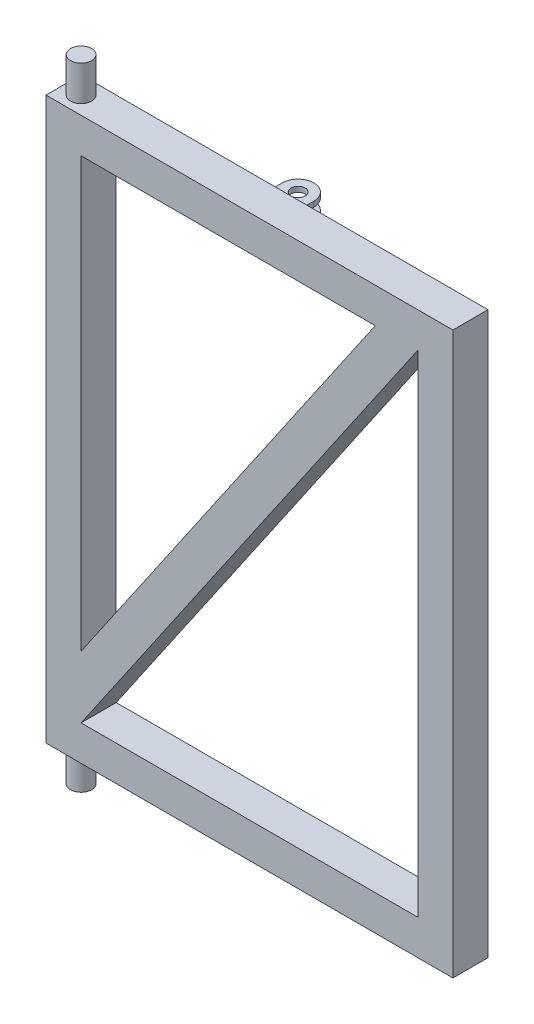
ISO-10303-21;
HEADER;
FILE_DESCRIPTION(('STEP AP214'),'2;1');
FILE_NAME('part.step','',(''),(''),'','','');
FILE_SCHEMA(('AUTOMOTIVE_DESIGN { 1 0 10303 214 1 1 1 1 }'));
ENDSEC;
DATA;
#1=APPLICATION_CONTEXT('core data for automotive mechanical design processes');
#2=APPLICATION_PROTOCOL_DEFINITION('international standard','automotive_design',2000,#1);
#3=PRODUCT_CONTEXT('',#1,'mechanical');
#4=PRODUCT('Part','Part','',(#3));
#5=PRODUCT_RELATED_PRODUCT_CATEGORY('part','',(#4));
#6=PRODUCT_DEFINITION_FORMATION('','',#4);
#7=PRODUCT_DEFINITION_CONTEXT('part definition',#1,'design');
#8=PRODUCT_DEFINITION('design','',#6,#7);
#9=PRODUCT_DEFINITION_SHAPE('','',#8);
#10=(LENGTH_UNIT() NAMED_UNIT(*) SI_UNIT(.MILLI.,.METRE.));
#11=(NAMED_UNIT(*) PLANE_ANGLE_UNIT() SI_UNIT($,.RADIAN.));
#12=(NAMED_UNIT(*) SI_UNIT($,.STERADIAN.) SOLID_ANGLE_UNIT());
#13=UNCERTAINTY_MEASURE_WITH_UNIT(LENGTH_MEASURE(1.E-05),#10,'distance_accuracy_value','');
#14=(GEOMETRIC_REPRESENTATION_CONTEXT(3) GLOBAL_UNCERTAINTY_ASSIGNED_CONTEXT((#13)) GLOBAL_UNIT_ASSIGNED_CONTEXT((#10,
#11,#12)) REPRESENTATION_CONTEXT('',''));
#15=CARTESIAN_POINT('',(0.,0.,0.));
#16=DIRECTION('',(0.,0.,1.));
#17=DIRECTION('',(1.,0.,0.));
#18=AXIS2_PLACEMENT_3D('',#15,#16,#17);
#19=CARTESIAN_POINT('',(311.828309325472,-10.,8.67811647649663));
#20=DIRECTION('',(-1.,0.,0.));
#21=DIRECTION('',(0.,0.,1.));
#22=AXIS2_PLACEMENT_3D('',#19,#20,#21);
#23=PLANE('',#22);
#24=DIRECTION('',(0.,0.,-1.));
#25=VECTOR('',#24,1.);
#26=CARTESIAN_POINT('',(311.828309325472,-32.5,8.67811647649663));
#27=LINE('',#26,#25);
#28=CARTESIAN_POINT('',(311.828309325472,-32.5,-4.9407549965398));
#29=VERTEX_POINT('',#28);
#30=CARTESIAN_POINT('',(311.828309325472,-32.5,-20.));
#31=VERTEX_POINT('',#30);
#32=EDGE_CURVE('E184',#29,#31,#27,.T.);
#33=ORIENTED_EDGE('',*,*,#32,.F.);
#34=DIRECTION('',(0.,1.,0.));
#35=VECTOR('',#34,1.);
#36=CARTESIAN_POINT('',(311.828309325472,-10.,-4.9407549965398));
#37=LINE('',#36,#35);
#38=CARTESIAN_POINT('',(311.828309325472,-17.5,-4.9407549965398));
#39=VERTEX_POINT('',#38);
#40=EDGE_CURVE('E186',#29,#39,#37,.T.);
#41=ORIENTED_EDGE('',*,*,#40,.T.);
#42=DIRECTION('',(0.,0.,-1.));
#43=VECTOR('',#42,1.);
#44=CARTESIAN_POINT('',(311.828309325472,-17.5,8.67811647649663));
#45=LINE('',#44,#43);
#46=CARTESIAN_POINT('',(311.828309325472,-17.5,-20.));
#47=VERTEX_POINT('',#46);
#48=EDGE_CURVE('E166',#39,#47,#45,.T.);
#49=ORIENTED_EDGE('',*,*,#48,.T.);
#50=DIRECTION('',(0.,-1.,0.));
#51=VECTOR('',#50,1.);
#52=CARTESIAN_POINT('',(311.828309325472,-10.,-20.));
#53=LINE('',#52,#51);
#54=CARTESIAN_POINT('',(311.828309325472,-10.,-20.));
#55=VERTEX_POINT('',#54);
#56=EDGE_CURVE('E213',#55,#47,#53,.T.);
#57=ORIENTED_EDGE('',*,*,#56,.F.);
#58=DIRECTION('',(0.,0.,-1.));
#59=VECTOR('',#58,1.);
#60=CARTESIAN_POINT('',(311.828309325472,-10.,8.67811647649663));
#61=LINE('',#60,#59);
#62=CARTESIAN_POINT('',(311.828309325472,-10.,0.));
#63=VERTEX_POINT('',#62);
#64=EDGE_CURVE('E195',#63,#55,#61,.T.);
#65=ORIENTED_EDGE('',*,*,#64,.F.);
#66=DIRECTION('',(0.,-1.,0.));
#67=VECTOR('',#66,1.);
#68=CARTESIAN_POINT('',(311.828309325472,0.,0.));
#69=LINE('',#68,#67);
#70=CARTESIAN_POINT('',(311.828309325472,-40.,0.));
#71=VERTEX_POINT('',#70);
#72=EDGE_CURVE('E40',#63,#71,#69,.T.);
#73=ORIENTED_EDGE('',*,*,#72,.T.);
#74=DIRECTION('',(0.,0.,-1.));
#75=VECTOR('',#74,1.);
#76=CARTESIAN_POINT('',(311.828309325472,-40.,8.67811647649663));
#77=LINE('',#76,#75);
#78=CARTESIAN_POINT('',(311.828309325472,-40.,-20.));
#79=VERTEX_POINT('',#78);
#80=EDGE_CURVE('E192',#71,#79,#77,.T.);
#81=ORIENTED_EDGE('',*,*,#80,.T.);
#82=EDGE_CURVE('E212',#31,#79,#53,.T.);
#83=ORIENTED_EDGE('',*,*,#82,.F.);
#84=EDGE_LOOP('',(#33,#41,#49,#57,#65,#73,#81,#83));
#85=FACE_BOUND('',#84,.T.);
#86=ADVANCED_FACE('F32',(#85),#23,.F.);
#87=CARTESIAN_POINT('',(266.828309325472,-10.,8.67811647649664));
#88=DIRECTION('',(1.,0.,0.));
#89=DIRECTION('',(0.,0.,-1.));
#90=AXIS2_PLACEMENT_3D('',#87,#88,#89);
#91=PLANE('',#90);
#92=DIRECTION('',(0.,0.,1.));
#93=VECTOR('',#92,1.);
#94=CARTESIAN_POINT('',(266.828309325472,-32.5,8.67811647649664));
#95=LINE('',#94,#93);
#96=CARTESIAN_POINT('',(266.828309325472,-32.5,-20.));
#97=VERTEX_POINT('',#96);
#98=CARTESIAN_POINT('',(266.828309325472,-32.5,-4.9407549965398));
#99=VERTEX_POINT('',#98);
#100=EDGE_CURVE('E182',#97,#99,#95,.T.);
#101=ORIENTED_EDGE('',*,*,#100,.F.);
#102=DIRECTION('',(0.,-1.,0.));
#103=VECTOR('',#102,1.);
#104=CARTESIAN_POINT('',(266.828309325472,-10.,-20.));
#105=LINE('',#104,#103);
#106=CARTESIAN_POINT('',(266.828309325472,-40.,-20.));
#107=VERTEX_POINT('',#106);
#108=EDGE_CURVE('E203',#97,#107,#105,.T.);
#109=ORIENTED_EDGE('',*,*,#108,.T.);
#110=DIRECTION('',(0.,0.,1.));
#111=VECTOR('',#110,1.);
#112=CARTESIAN_POINT('',(266.828309325472,-40.,8.67811647649664));
#113=LINE('',#112,#111);
#114=CARTESIAN_POINT('',(266.828309325472,-40.,0.));
#115=VERTEX_POINT('',#114);
#116=EDGE_CURVE('E198',#107,#115,#113,.T.);
#117=ORIENTED_EDGE('',*,*,#116,.T.);
#118=DIRECTION('',(0.,1.,0.));
#119=VECTOR('',#118,1.);
#120=CARTESIAN_POINT('',(266.828309325472,0.,0.));
#121=LINE('',#120,#119);
#122=CARTESIAN_POINT('',(266.828309325472,-10.,0.));
#123=VERTEX_POINT('',#122);
#124=EDGE_CURVE('E306',#115,#123,#121,.T.);
#125=ORIENTED_EDGE('',*,*,#124,.T.);
#126=DIRECTION('',(0.,0.,1.));
#127=VECTOR('',#126,1.);
#128=CARTESIAN_POINT('',(266.828309325472,-10.,8.67811647649664));
#129=LINE('',#128,#127);
#130=CARTESIAN_POINT('',(266.828309325472,-10.,-20.));
#131=VERTEX_POINT('',#130);
#132=EDGE_CURVE('E200',#131,#123,#129,.T.);
#133=ORIENTED_EDGE('',*,*,#132,.F.);
#134=CARTESIAN_POINT('',(266.828309325472,-17.5,-20.));
#135=VERTEX_POINT('',#134);
#136=EDGE_CURVE('E172',#131,#135,#105,.T.);
#137=ORIENTED_EDGE('',*,*,#136,.T.);
#138=DIRECTION('',(0.,0.,1.));
#139=VECTOR('',#138,1.);
#140=CARTESIAN_POINT('',(266.828309325472,-17.5,8.67811647649664));
#141=LINE('',#140,#139);
#142=CARTESIAN_POINT('',(266.828309325472,-17.5,-4.9407549965398));
#143=VERTEX_POINT('',#142);
#144=EDGE_CURVE('E47',#135,#143,#141,.T.);
#145=ORIENTED_EDGE('',*,*,#144,.T.);
#146=DIRECTION('',(0.,-1.,0.));
#147=VECTOR('',#146,1.);
#148=CARTESIAN_POINT('',(266.828309325472,-10.,-4.9407549965398));
#149=LINE('',#148,#147);
#150=EDGE_CURVE('E11',#143,#99,#149,.T.);
#151=ORIENTED_EDGE('',*,*,#150,.T.);
#152=EDGE_LOOP('',(#101,#109,#117,#125,#133,#137,#145,#151));
#153=FACE_BOUND('',#152,.T.);
#154=ADVANCED_FACE('F169',(#153),#91,.F.);
#155=CARTESIAN_POINT('',(289.328309325472,-10.,-20.));
#156=DIRECTION('',(0.,-1.,0.));
#157=DIRECTION('',(0.,0.,-1.));
#158=AXIS2_PLACEMENT_3D('',#155,#156,#157);
#159=CYLINDRICAL_SURFACE('',#158,22.5);
#160=CARTESIAN_POINT('',(289.328309325472,-32.5,-20.));
#161=DIRECTION('',(0.,1.,0.));
#162=DIRECTION('',(0.,0.,1.));
#163=AXIS2_PLACEMENT_3D('',#160,#161,#162);
#164=CIRCLE('',#163,22.5);
#165=EDGE_CURVE('E180',#31,#97,#164,.T.);
#166=ORIENTED_EDGE('',*,*,#165,.F.);
#167=ORIENTED_EDGE('',*,*,#82,.T.);
#168=CARTESIAN_POINT('',(289.328309325472,-40.,-20.));
#169=DIRECTION('',(0.,1.,0.));
#170=DIRECTION('',(0.,0.,1.));
#171=AXIS2_PLACEMENT_3D('',#168,#169,#170);
#172=CIRCLE('',#171,22.5);
#173=EDGE_CURVE('E206',#79,#107,#172,.T.);
#174=ORIENTED_EDGE('',*,*,#173,.T.);
#175=ORIENTED_EDGE('',*,*,#108,.F.);
#176=EDGE_LOOP('',(#166,#167,#174,#175));
#177=FACE_BOUND('',#176,.T.);
#178=ADVANCED_FACE('F331',(#177),#159,.T.);
#179=CARTESIAN_POINT('',(289.328309325472,-10.,-20.));
#180=DIRECTION('',(0.,-1.,0.));
#181=DIRECTION('',(0.,0.,-1.));
#182=AXIS2_PLACEMENT_3D('',#179,#180,#181);
#183=CYLINDRICAL_SURFACE('',#182,9.99999999999998);
#184=CARTESIAN_POINT('',(289.328309325472,-40.,-20.));
#185=DIRECTION('',(0.,1.,0.));
#186=DIRECTION('',(0.,0.,1.));
#187=AXIS2_PLACEMENT_3D('',#184,#185,#186);
#188=CIRCLE('',#187,9.99999999999998);
#189=CARTESIAN_POINT('',(289.328309325472,-40.,-10.));
#190=VERTEX_POINT('',#189);
#191=EDGE_CURVE('E188',#190,#190,#188,.T.);
#192=ORIENTED_EDGE('',*,*,#191,.F.);
#193=EDGE_LOOP('',(#192));
#194=FACE_BOUND('',#193,.T.);
#195=CARTESIAN_POINT('',(289.328309325472,-32.5,-20.));
#196=DIRECTION('',(0.,1.,0.));
#197=DIRECTION('',(0.,0.,1.));
#198=AXIS2_PLACEMENT_3D('',#195,#196,#197);
#199=CIRCLE('',#198,9.99999999999998);
#200=CARTESIAN_POINT('',(289.328309325472,-32.5,-10.));
#201=VERTEX_POINT('',#200);
#202=EDGE_CURVE('E175',#201,#201,#199,.T.);
#203=ORIENTED_EDGE('',*,*,#202,.T.);
#204=EDGE_LOOP('',(#203));
#205=FACE_BOUND('',#204,.T.);
#206=ADVANCED_FACE('F319',(#194,#205),#183,.F.);
#207=CARTESIAN_POINT('',(0.,0.,0.));
#208=DIRECTION('',(0.,0.,1.));
#209=DIRECTION('',(1.,0.,0.));
#210=AXIS2_PLACEMENT_3D('',#207,#208,#209);
#211=PLANE('',#210);
#212=DIRECTION('',(-0.565528355551528,-0.824728851845978,0.));
#213=VECTOR('',#212,1.);
#214=CARTESIAN_POINT('',(530.,-50.,0.));
#215=LINE('',#214,#213);
#216=CARTESIAN_POINT('',(530.,-50.,0.));
#217=VERTEX_POINT('',#216);
#218=CARTESIAN_POINT('',(50.,-750.,0.));
#219=VERTEX_POINT('',#218);
#220=EDGE_CURVE('E222',#217,#219,#215,.T.);
#221=ORIENTED_EDGE('',*,*,#220,.T.);
#222=DIRECTION('',(1.,0.,0.));
#223=VECTOR('',#222,1.);
#224=CARTESIAN_POINT('',(50.,-750.,0.));
#225=LINE('',#224,#223);
#226=CARTESIAN_POINT('',(530.,-750.,0.));
#227=VERTEX_POINT('',#226);
#228=EDGE_CURVE('E234',#219,#227,#225,.T.);
#229=ORIENTED_EDGE('',*,*,#228,.T.);
#230=DIRECTION('',(0.,1.,0.));
#231=VECTOR('',#230,1.);
#232=CARTESIAN_POINT('',(530.,-50.,0.));
#233=LINE('',#232,#231);
#234=EDGE_CURVE('E226',#227,#217,#233,.T.);
#235=ORIENTED_EDGE('',*,*,#234,.T.);
#236=EDGE_LOOP('',(#221,#229,#235));
#237=FACE_BOUND('',#236,.T.);
#238=DIRECTION('',(0.,-1.,0.));
#239=VECTOR('',#238,1.);
#240=CARTESIAN_POINT('',(0.,0.,0.));
#241=LINE('',#240,#239);
#242=CARTESIAN_POINT('',(0.,0.,0.));
#243=VERTEX_POINT('',#242);
#244=CARTESIAN_POINT('',(0.,-800.,0.));
#245=VERTEX_POINT('',#244);
#246=EDGE_CURVE('E270',#243,#245,#241,.T.);
#247=ORIENTED_EDGE('',*,*,#246,.F.);
#248=DIRECTION('',(-1.,0.,0.));
#249=VECTOR('',#248,1.);
#250=CARTESIAN_POINT('',(0.,0.,0.));
#251=LINE('',#250,#249);
#252=CARTESIAN_POINT('',(580.,0.,0.));
#253=VERTEX_POINT('',#252);
#254=EDGE_CURVE('E275',#253,#243,#251,.T.);
#255=ORIENTED_EDGE('',*,*,#254,.F.);
#256=DIRECTION('',(0.,1.,0.));
#257=VECTOR('',#256,1.);
#258=CARTESIAN_POINT('',(580.,0.,0.));
#259=LINE('',#258,#257);
#260=CARTESIAN_POINT('',(580.,-800.,0.));
#261=VERTEX_POINT('',#260);
#262=EDGE_CURVE('E286',#261,#253,#259,.T.);
#263=ORIENTED_EDGE('',*,*,#262,.F.);
#264=DIRECTION('',(1.,0.,0.));
#265=VECTOR('',#264,1.);
#266=CARTESIAN_POINT('',(0.,-800.,0.));
#267=LINE('',#266,#265);
#268=EDGE_CURVE('E284',#245,#261,#267,.T.);
#269=ORIENTED_EDGE('',*,*,#268,.F.);
#270=EDGE_LOOP('',(#247,#255,#263,#269));
#271=FACE_BOUND('',#270,.T.);
#272=DIRECTION('',(0.,-1.,0.));
#273=VECTOR('',#272,1.);
#274=CARTESIAN_POINT('',(50.,-50.,0.));
#275=LINE('',#274,#273);
#276=CARTESIAN_POINT('',(50.,-50.,0.));
#277=VERTEX_POINT('',#276);
#278=CARTESIAN_POINT('',(50.0000000000001,-661.587103441987,0.));
#279=VERTEX_POINT('',#278);
#280=EDGE_CURVE('E246',#277,#279,#275,.T.);
#281=ORIENTED_EDGE('',*,*,#280,.T.);
#282=DIRECTION('',(0.565528355551528,0.824728851845978,0.));
#283=VECTOR('',#282,1.);
#284=CARTESIAN_POINT('',(469.374013788791,-50.,0.));
#285=LINE('',#284,#283);
#286=CARTESIAN_POINT('',(469.374013788791,-50.,0.));
#287=VERTEX_POINT('',#286);
#288=EDGE_CURVE('E258',#279,#287,#285,.T.);
#289=ORIENTED_EDGE('',*,*,#288,.T.);
#290=DIRECTION('',(-1.,0.,0.));
#291=VECTOR('',#290,1.);
#292=CARTESIAN_POINT('',(50.,-50.,0.));
#293=LINE('',#292,#291);
#294=EDGE_CURVE('E250',#287,#277,#293,.T.);
#295=ORIENTED_EDGE('',*,*,#294,.T.);
#296=EDGE_LOOP('',(#281,#289,#295));
#297=FACE_BOUND('',#296,.T.);
#298=ORIENTED_EDGE('',*,*,#72,.F.);
#299=DIRECTION('',(-1.,0.,0.));
#300=VECTOR('',#299,1.);
#301=CARTESIAN_POINT('',(0.,-10.,0.));
#302=LINE('',#301,#300);
#303=EDGE_CURVE('E312',#63,#123,#302,.T.);
#304=ORIENTED_EDGE('',*,*,#303,.T.);
#305=ORIENTED_EDGE('',*,*,#124,.F.);
#306=DIRECTION('',(-1.,0.,0.));
#307=VECTOR('',#306,1.);
#308=CARTESIAN_POINT('',(0.,-40.,0.));
#309=LINE('',#308,#307);
#310=EDGE_CURVE('E309',#71,#115,#309,.T.);
#311=ORIENTED_EDGE('',*,*,#310,.F.);
#312=EDGE_LOOP('',(#298,#304,#305,#311));
#313=FACE_BOUND('',#312,.T.);
#314=ADVANCED_FACE('F409',(#237,#271,#297,#313),#211,.F.);
#315=CARTESIAN_POINT('',(0.,-800.,50.));
#316=DIRECTION('',(0.,1.,0.));
#317=DIRECTION('',(0.,0.,1.));
#318=AXIS2_PLACEMENT_3D('',#315,#316,#317);
#319=PLANE('',#318);
#320=ORIENTED_EDGE('',*,*,#268,.T.);
#321=DIRECTION('',(0.,0.,-1.));
#322=VECTOR('',#321,1.);
#323=CARTESIAN_POINT('',(580.,-800.,50.));
#324=LINE('',#323,#322);
#325=CARTESIAN_POINT('',(580.,-800.,50.));
#326=VERTEX_POINT('',#325);
#327=EDGE_CURVE('E294',#326,#261,#324,.T.);
#328=ORIENTED_EDGE('',*,*,#327,.F.);
#329=DIRECTION('',(1.,0.,0.));
#330=VECTOR('',#329,1.);
#331=CARTESIAN_POINT('',(0.,-800.,50.));
#332=LINE('',#331,#330);
#333=CARTESIAN_POINT('',(0.,-800.,50.));
#334=VERTEX_POINT('',#333);
#335=EDGE_CURVE('E274',#334,#326,#332,.T.);
#336=ORIENTED_EDGE('',*,*,#335,.F.);
#337=DIRECTION('',(0.,0.,-1.));
#338=VECTOR('',#337,1.);
#339=CARTESIAN_POINT('',(0.,-800.,50.));
#340=LINE('',#339,#338);
#341=EDGE_CURVE('E297',#334,#245,#340,.T.);
#342=ORIENTED_EDGE('',*,*,#341,.T.);
#343=EDGE_LOOP('',(#320,#328,#336,#342));
#344=FACE_BOUND('',#343,.T.);
#345=CARTESIAN_POINT('',(25.0000000000001,-800.,25.));
#346=DIRECTION('',(0.,1.,0.));
#347=DIRECTION('',(0.,0.,1.));
#348=AXIS2_PLACEMENT_3D('',#345,#346,#347);
#349=CIRCLE('',#348,15.1806494494517);
#350=CARTESIAN_POINT('',(25.0000000000001,-800.,40.1806494494517));
#351=VERTEX_POINT('',#350);
#352=EDGE_CURVE('E303',#351,#351,#349,.F.);
#353=ORIENTED_EDGE('',*,*,#352,.F.);
#354=EDGE_LOOP('',(#353));
#355=FACE_BOUND('',#354,.T.);
#356=ADVANCED_FACE('F412',(#344,#355),#319,.F.);
#357=CARTESIAN_POINT('',(0.,0.,50.));
#358=DIRECTION('',(0.,-1.,0.));
#359=DIRECTION('',(0.,0.,-1.));
#360=AXIS2_PLACEMENT_3D('',#357,#358,#359);
#361=PLANE('',#360);
#362=ORIENTED_EDGE('',*,*,#254,.T.);
#363=DIRECTION('',(0.,0.,-1.));
#364=VECTOR('',#363,1.);
#365=CARTESIAN_POINT('',(0.,0.,50.));
#366=LINE('',#365,#364);
#367=CARTESIAN_POINT('',(0.,0.,50.));
#368=VERTEX_POINT('',#367);
#369=EDGE_CURVE('E281',#368,#243,#366,.T.);
#370=ORIENTED_EDGE('',*,*,#369,.F.);
#371=DIRECTION('',(-1.,0.,0.));
#372=VECTOR('',#371,1.);
#373=CARTESIAN_POINT('',(0.,0.,50.));
#374=LINE('',#373,#372);
#375=CARTESIAN_POINT('',(580.,0.,50.));
#376=VERTEX_POINT('',#375);
#377=EDGE_CURVE('E279',#376,#368,#374,.T.);
#378=ORIENTED_EDGE('',*,*,#377,.F.);
#379=DIRECTION('',(0.,0.,-1.));
#380=VECTOR('',#379,1.);
#381=CARTESIAN_POINT('',(580.,0.,50.));
#382=LINE('',#381,#380);
#383=EDGE_CURVE('E291',#376,#253,#382,.T.);
#384=ORIENTED_EDGE('',*,*,#383,.T.);
#385=EDGE_LOOP('',(#362,#370,#378,#384));
#386=FACE_BOUND('',#385,.T.);
#387=CARTESIAN_POINT('',(25.,0.,25.));
#388=DIRECTION('',(0.,-1.,0.));
#389=DIRECTION('',(0.,0.,-1.));
#390=AXIS2_PLACEMENT_3D('',#387,#388,#389);
#391=CIRCLE('',#390,15.);
#392=CARTESIAN_POINT('',(25.,0.,10.));
#393=VERTEX_POINT('',#392);
#394=EDGE_CURVE('E300',#393,#393,#391,.F.);
#395=ORIENTED_EDGE('',*,*,#394,.F.);
#396=EDGE_LOOP('',(#395));
#397=FACE_BOUND('',#396,.T.);
#398=ADVANCED_FACE('F407',(#386,#397),#361,.F.);
#399=CARTESIAN_POINT('',(0.,0.,50.));
#400=DIRECTION('',(0.,0.,1.));
#401=DIRECTION('',(1.,0.,0.));
#402=AXIS2_PLACEMENT_3D('',#399,#400,#401);
#403=PLANE('',#402);
#404=DIRECTION('',(0.565528355551528,0.824728851845978,0.));
#405=VECTOR('',#404,1.);
#406=CARTESIAN_POINT('',(469.374013788791,-50.,50.));
#407=LINE('',#406,#405);
#408=CARTESIAN_POINT('',(50.0000000000001,-661.587103441987,50.));
#409=VERTEX_POINT('',#408);
#410=CARTESIAN_POINT('',(469.374013788791,-50.,50.));
#411=VERTEX_POINT('',#410);
#412=EDGE_CURVE('E249',#409,#411,#407,.T.);
#413=ORIENTED_EDGE('',*,*,#412,.F.);
#414=DIRECTION('',(0.,-1.,0.));
#415=VECTOR('',#414,1.);
#416=CARTESIAN_POINT('',(50.,-50.,50.));
#417=LINE('',#416,#415);
#418=CARTESIAN_POINT('',(50.,-50.,50.));
#419=VERTEX_POINT('',#418);
#420=EDGE_CURVE('E247',#419,#409,#417,.T.);
#421=ORIENTED_EDGE('',*,*,#420,.F.);
#422=DIRECTION('',(-1.,0.,0.));
#423=VECTOR('',#422,1.);
#424=CARTESIAN_POINT('',(50.,-50.,50.));
#425=LINE('',#424,#423);
#426=EDGE_CURVE('E253',#411,#419,#425,.T.);
#427=ORIENTED_EDGE('',*,*,#426,.F.);
#428=EDGE_LOOP('',(#413,#421,#427));
#429=FACE_BOUND('',#428,.T.);
#430=DIRECTION('',(0.,-1.,0.));
#431=VECTOR('',#430,1.);
#432=CARTESIAN_POINT('',(0.,0.,50.));
#433=LINE('',#432,#431);
#434=EDGE_CURVE('E271',#368,#334,#433,.T.);
#435=ORIENTED_EDGE('',*,*,#434,.T.);
#436=ORIENTED_EDGE('',*,*,#335,.T.);
#437=DIRECTION('',(0.,1.,0.));
#438=VECTOR('',#437,1.);
#439=CARTESIAN_POINT('',(580.,0.,50.));
#440=LINE('',#439,#438);
#441=EDGE_CURVE('E277',#326,#376,#440,.T.);
#442=ORIENTED_EDGE('',*,*,#441,.T.);
#443=ORIENTED_EDGE('',*,*,#377,.T.);
#444=EDGE_LOOP('',(#435,#436,#442,#443));
#445=FACE_BOUND('',#444,.T.);
#446=DIRECTION('',(1.,0.,0.));
#447=VECTOR('',#446,1.);
#448=CARTESIAN_POINT('',(50.,-750.,50.));
#449=LINE('',#448,#447);
#450=CARTESIAN_POINT('',(50.,-750.,50.));
#451=VERTEX_POINT('',#450);
#452=CARTESIAN_POINT('',(530.,-750.,50.));
#453=VERTEX_POINT('',#452);
#454=EDGE_CURVE('E225',#451,#453,#449,.T.);
#455=ORIENTED_EDGE('',*,*,#454,.F.);
#456=DIRECTION('',(-0.565528355551528,-0.824728851845978,0.));
#457=VECTOR('',#456,1.);
#458=CARTESIAN_POINT('',(530.,-50.,50.));
#459=LINE('',#458,#457);
#460=CARTESIAN_POINT('',(530.,-50.,50.));
#461=VERTEX_POINT('',#460);
#462=EDGE_CURVE('E223',#461,#451,#459,.T.);
#463=ORIENTED_EDGE('',*,*,#462,.F.);
#464=DIRECTION('',(0.,1.,0.));
#465=VECTOR('',#464,1.);
#466=CARTESIAN_POINT('',(530.,-50.,50.));
#467=LINE('',#466,#465);
#468=EDGE_CURVE('E229',#453,#461,#467,.T.);
#469=ORIENTED_EDGE('',*,*,#468,.F.);
#470=EDGE_LOOP('',(#455,#463,#469));
#471=FACE_BOUND('',#470,.T.);
#472=ADVANCED_FACE('F404',(#429,#445,#471),#403,.T.);
#473=CARTESIAN_POINT('',(0.,0.,50.));
#474=DIRECTION('',(1.,0.,0.));
#475=DIRECTION('',(0.,1.,0.));
#476=AXIS2_PLACEMENT_3D('',#473,#474,#475);
#477=PLANE('',#476);
#478=ORIENTED_EDGE('',*,*,#246,.T.);
#479=ORIENTED_EDGE('',*,*,#341,.F.);
#480=ORIENTED_EDGE('',*,*,#434,.F.);
#481=ORIENTED_EDGE('',*,*,#369,.T.);
#482=EDGE_LOOP('',(#478,#479,#480,#481));
#483=FACE_BOUND('',#482,.T.);
#484=ADVANCED_FACE('F34',(#483),#477,.F.);
#485=CARTESIAN_POINT('',(580.,0.,50.));
#486=DIRECTION('',(-1.,0.,0.));
#487=DIRECTION('',(0.,-1.,0.));
#488=AXIS2_PLACEMENT_3D('',#485,#486,#487);
#489=PLANE('',#488);
#490=ORIENTED_EDGE('',*,*,#262,.T.);
#491=ORIENTED_EDGE('',*,*,#383,.F.);
#492=ORIENTED_EDGE('',*,*,#441,.F.);
#493=ORIENTED_EDGE('',*,*,#327,.T.);
#494=EDGE_LOOP('',(#490,#491,#492,#493));
#495=FACE_BOUND('',#494,.T.);
#496=ADVANCED_FACE('F402',(#495),#489,.F.);
#497=CARTESIAN_POINT('',(50.,-50.,50.));
#498=DIRECTION('',(1.,0.,0.));
#499=DIRECTION('',(0.,1.,0.));
#500=AXIS2_PLACEMENT_3D('',#497,#498,#499);
#501=PLANE('',#500);
#502=ORIENTED_EDGE('',*,*,#280,.F.);
#503=DIRECTION('',(0.,0.,-1.));
#504=VECTOR('',#503,1.);
#505=CARTESIAN_POINT('',(50.,-50.,50.));
#506=LINE('',#505,#504);
#507=EDGE_CURVE('E255',#419,#277,#506,.T.);
#508=ORIENTED_EDGE('',*,*,#507,.F.);
#509=ORIENTED_EDGE('',*,*,#420,.T.);
#510=DIRECTION('',(0.,0.,-1.));
#511=VECTOR('',#510,1.);
#512=CARTESIAN_POINT('',(50.0000000000001,-661.587103441987,50.));
#513=LINE('',#512,#511);
#514=EDGE_CURVE('E267',#409,#279,#513,.T.);
#515=ORIENTED_EDGE('',*,*,#514,.T.);
#516=EDGE_LOOP('',(#502,#508,#509,#515));
#517=FACE_BOUND('',#516,.T.);
#518=ADVANCED_FACE('F398',(#517),#501,.T.);
#519=CARTESIAN_POINT('',(469.374013788791,-50.,50.));
#520=DIRECTION('',(-0.824728851845978,0.565528355551528,0.));
#521=DIRECTION('',(-0.565528355551528,-0.824728851845978,0.));
#522=AXIS2_PLACEMENT_3D('',#519,#520,#521);
#523=PLANE('',#522);
#524=ORIENTED_EDGE('',*,*,#288,.F.);
#525=ORIENTED_EDGE('',*,*,#514,.F.);
#526=ORIENTED_EDGE('',*,*,#412,.T.);
#527=DIRECTION('',(0.,0.,-1.));
#528=VECTOR('',#527,1.);
#529=CARTESIAN_POINT('',(469.374013788791,-50.,50.));
#530=LINE('',#529,#528);
#531=EDGE_CURVE('E265',#411,#287,#530,.T.);
#532=ORIENTED_EDGE('',*,*,#531,.T.);
#533=EDGE_LOOP('',(#524,#525,#526,#532));
#534=FACE_BOUND('',#533,.T.);
#535=ADVANCED_FACE('F394',(#534),#523,.T.);
#536=CARTESIAN_POINT('',(50.,-50.,50.));
#537=DIRECTION('',(0.,-1.,0.));
#538=DIRECTION('',(1.,0.,0.));
#539=AXIS2_PLACEMENT_3D('',#536,#537,#538);
#540=PLANE('',#539);
#541=ORIENTED_EDGE('',*,*,#294,.F.);
#542=ORIENTED_EDGE('',*,*,#531,.F.);
#543=ORIENTED_EDGE('',*,*,#426,.T.);
#544=ORIENTED_EDGE('',*,*,#507,.T.);
#545=EDGE_LOOP('',(#541,#542,#543,#544));
#546=FACE_BOUND('',#545,.T.);
#547=ADVANCED_FACE('F390',(#546),#540,.T.);
#548=CARTESIAN_POINT('',(530.,-50.,50.));
#549=DIRECTION('',(0.824728851845978,-0.565528355551528,0.));
#550=DIRECTION('',(0.565528355551528,0.824728851845978,0.));
#551=AXIS2_PLACEMENT_3D('',#548,#549,#550);
#552=PLANE('',#551);
#553=ORIENTED_EDGE('',*,*,#220,.F.);
#554=DIRECTION('',(0.,0.,-1.));
#555=VECTOR('',#554,1.);
#556=CARTESIAN_POINT('',(530.,-50.,50.));
#557=LINE('',#556,#555);
#558=EDGE_CURVE('E231',#461,#217,#557,.T.);
#559=ORIENTED_EDGE('',*,*,#558,.F.);
#560=ORIENTED_EDGE('',*,*,#462,.T.);
#561=DIRECTION('',(0.,0.,-1.));
#562=VECTOR('',#561,1.);
#563=CARTESIAN_POINT('',(50.,-750.,50.));
#564=LINE('',#563,#562);
#565=EDGE_CURVE('E243',#451,#219,#564,.T.);
#566=ORIENTED_EDGE('',*,*,#565,.T.);
#567=EDGE_LOOP('',(#553,#559,#560,#566));
#568=FACE_BOUND('',#567,.T.);
#569=ADVANCED_FACE('F386',(#568),#552,.T.);
#570=CARTESIAN_POINT('',(50.,-750.,50.));
#571=DIRECTION('',(0.,1.,0.));
#572=DIRECTION('',(0.,0.,1.));
#573=AXIS2_PLACEMENT_3D('',#570,#571,#572);
#574=PLANE('',#573);
#575=ORIENTED_EDGE('',*,*,#228,.F.);
#576=ORIENTED_EDGE('',*,*,#565,.F.);
#577=ORIENTED_EDGE('',*,*,#454,.T.);
#578=DIRECTION('',(0.,0.,-1.));
#579=VECTOR('',#578,1.);
#580=CARTESIAN_POINT('',(530.,-750.,50.));
#581=LINE('',#580,#579);
#582=EDGE_CURVE('E241',#453,#227,#581,.T.);
#583=ORIENTED_EDGE('',*,*,#582,.T.);
#584=EDGE_LOOP('',(#575,#576,#577,#583));
#585=FACE_BOUND('',#584,.T.);
#586=ADVANCED_FACE('F382',(#585),#574,.T.);
#587=CARTESIAN_POINT('',(530.,-50.,50.));
#588=DIRECTION('',(-1.,0.,0.));
#589=DIRECTION('',(0.,-1.,0.));
#590=AXIS2_PLACEMENT_3D('',#587,#588,#589);
#591=PLANE('',#590);
#592=ORIENTED_EDGE('',*,*,#234,.F.);
#593=ORIENTED_EDGE('',*,*,#582,.F.);
#594=ORIENTED_EDGE('',*,*,#468,.T.);
#595=ORIENTED_EDGE('',*,*,#558,.T.);
#596=EDGE_LOOP('',(#592,#593,#594,#595));
#597=FACE_BOUND('',#596,.T.);
#598=ADVANCED_FACE('F378',(#597),#591,.T.);
#599=CARTESIAN_POINT('',(25.,50.,25.));
#600=DIRECTION('',(0.,-1.,0.));
#601=DIRECTION('',(0.,0.,-1.));
#602=AXIS2_PLACEMENT_3D('',#599,#600,#601);
#603=CYLINDRICAL_SURFACE('',#602,15.);
#604=CARTESIAN_POINT('',(25.,50.,25.));
#605=DIRECTION('',(0.,1.,0.));
#606=DIRECTION('',(0.,0.,1.));
#607=AXIS2_PLACEMENT_3D('',#604,#605,#606);
#608=CIRCLE('',#607,15.);
#609=CARTESIAN_POINT('',(25.,50.,40.));
#610=VERTEX_POINT('',#609);
#611=EDGE_CURVE('E219',#610,#610,#608,.T.);
#612=ORIENTED_EDGE('',*,*,#611,.F.);
#613=EDGE_LOOP('',(#612));
#614=FACE_BOUND('',#613,.T.);
#615=ORIENTED_EDGE('',*,*,#394,.T.);
#616=EDGE_LOOP('',(#615));
#617=FACE_BOUND('',#616,.T.);
#618=ADVANCED_FACE('F374',(#614,#617),#603,.T.);
#619=CARTESIAN_POINT('',(25.,50.,25.));
#620=DIRECTION('',(0.,1.,0.));
#621=DIRECTION('',(0.,0.,1.));
#622=AXIS2_PLACEMENT_3D('',#619,#620,#621);
#623=PLANE('',#622);
#624=ORIENTED_EDGE('',*,*,#611,.T.);
#625=EDGE_LOOP('',(#624));
#626=FACE_BOUND('',#625,.T.);
#627=ADVANCED_FACE('F370',(#626),#623,.T.);
#628=CARTESIAN_POINT('',(25.0000000000001,-850.,25.));
#629=DIRECTION('',(0.,1.,0.));
#630=DIRECTION('',(0.,0.,1.));
#631=AXIS2_PLACEMENT_3D('',#628,#629,#630);
#632=CYLINDRICAL_SURFACE('',#631,15.1806494494517);
#633=CARTESIAN_POINT('',(25.0000000000001,-850.,25.));
#634=DIRECTION('',(0.,-1.,0.));
#635=DIRECTION('',(0.,0.,-1.));
#636=AXIS2_PLACEMENT_3D('',#633,#634,#635);
#637=CIRCLE('',#636,15.1806494494517);
#638=CARTESIAN_POINT('',(25.0000000000001,-850.,9.81935055054828));
#639=VERTEX_POINT('',#638);
#640=EDGE_CURVE('E216',#639,#639,#637,.T.);
#641=ORIENTED_EDGE('',*,*,#640,.F.);
#642=EDGE_LOOP('',(#641));
#643=FACE_BOUND('',#642,.T.);
#644=ORIENTED_EDGE('',*,*,#352,.T.);
#645=EDGE_LOOP('',(#644));
#646=FACE_BOUND('',#645,.T.);
#647=ADVANCED_FACE('F366',(#643,#646),#632,.T.);
#648=CARTESIAN_POINT('',(25.0000000000001,-850.,25.));
#649=DIRECTION('',(0.,-1.,0.));
#650=DIRECTION('',(0.,0.,-1.));
#651=AXIS2_PLACEMENT_3D('',#648,#649,#650);
#652=PLANE('',#651);
#653=ORIENTED_EDGE('',*,*,#640,.T.);
#654=EDGE_LOOP('',(#653));
#655=FACE_BOUND('',#654,.T.);
#656=ADVANCED_FACE('F363',(#655),#652,.T.);
#657=CARTESIAN_POINT('',(289.328309325472,-10.,-20.));
#658=DIRECTION('',(0.,1.,0.));
#659=DIRECTION('',(0.,0.,1.));
#660=AXIS2_PLACEMENT_3D('',#657,#658,#659);
#661=PLANE('',#660);
#662=CARTESIAN_POINT('',(289.328309325472,-10.,-20.));
#663=DIRECTION('',(0.,1.,0.));
#664=DIRECTION('',(0.,0.,1.));
#665=AXIS2_PLACEMENT_3D('',#662,#663,#664);
#666=CIRCLE('',#665,9.99999999999998);
#667=CARTESIAN_POINT('',(289.328309325472,-10.,-10.));
#668=VERTEX_POINT('',#667);
#669=EDGE_CURVE('E189',#668,#668,#666,.T.);
#670=ORIENTED_EDGE('',*,*,#669,.F.);
#671=EDGE_LOOP('',(#670));
#672=FACE_BOUND('',#671,.T.);
#673=ORIENTED_EDGE('',*,*,#303,.F.);
#674=ORIENTED_EDGE('',*,*,#64,.T.);
#675=CARTESIAN_POINT('',(289.328309325472,-10.,-20.));
#676=DIRECTION('',(0.,1.,0.));
#677=DIRECTION('',(0.,0.,1.));
#678=AXIS2_PLACEMENT_3D('',#675,#676,#677);
#679=CIRCLE('',#678,22.5);
#680=EDGE_CURVE('E197',#55,#131,#679,.T.);
#681=ORIENTED_EDGE('',*,*,#680,.T.);
#682=ORIENTED_EDGE('',*,*,#132,.T.);
#683=EDGE_LOOP('',(#673,#674,#681,#682));
#684=FACE_BOUND('',#683,.T.);
#685=ADVANCED_FACE('F339',(#672,#684),#661,.T.);
#686=CARTESIAN_POINT('',(289.328309325472,-40.,-20.));
#687=DIRECTION('',(0.,1.,0.));
#688=DIRECTION('',(0.,0.,1.));
#689=AXIS2_PLACEMENT_3D('',#686,#687,#688);
#690=PLANE('',#689);
#691=ORIENTED_EDGE('',*,*,#191,.T.);
#692=EDGE_LOOP('',(#691));
#693=FACE_BOUND('',#692,.T.);
#694=ORIENTED_EDGE('',*,*,#80,.F.);
#695=ORIENTED_EDGE('',*,*,#310,.T.);
#696=ORIENTED_EDGE('',*,*,#116,.F.);
#697=ORIENTED_EDGE('',*,*,#173,.F.);
#698=EDGE_LOOP('',(#694,#695,#696,#697));
#699=FACE_BOUND('',#698,.T.);
#700=ADVANCED_FACE('F337',(#693,#699),#690,.F.);
#701=ORIENTED_EDGE('',*,*,#56,.T.);
#702=CARTESIAN_POINT('',(289.328309325472,-17.5,-20.));
#703=DIRECTION('',(0.,1.,0.));
#704=DIRECTION('',(0.,0.,1.));
#705=AXIS2_PLACEMENT_3D('',#702,#703,#704);
#706=CIRCLE('',#705,22.5);
#707=EDGE_CURVE('E173',#47,#135,#706,.T.);
#708=ORIENTED_EDGE('',*,*,#707,.T.);
#709=ORIENTED_EDGE('',*,*,#136,.F.);
#710=ORIENTED_EDGE('',*,*,#680,.F.);
#711=EDGE_LOOP('',(#701,#708,#709,#710));
#712=FACE_BOUND('',#711,.T.);
#713=ADVANCED_FACE('F343',(#712),#159,.T.);
#714=CARTESIAN_POINT('',(289.328309325472,-17.5,-20.));
#715=DIRECTION('',(0.,1.,0.));
#716=DIRECTION('',(0.,0.,1.));
#717=AXIS2_PLACEMENT_3D('',#714,#715,#716);
#718=CIRCLE('',#717,9.99999999999998);
#719=CARTESIAN_POINT('',(289.328309325472,-17.5,-10.));
#720=VERTEX_POINT('',#719);
#721=EDGE_CURVE('E177',#720,#720,#718,.T.);
#722=ORIENTED_EDGE('',*,*,#721,.F.);
#723=EDGE_LOOP('',(#722));
#724=FACE_BOUND('',#723,.T.);
#725=ORIENTED_EDGE('',*,*,#669,.T.);
#726=EDGE_LOOP('',(#725));
#727=FACE_BOUND('',#726,.T.);
#728=ADVANCED_FACE('F345',(#724,#727),#183,.F.);
#729=CARTESIAN_POINT('',(250.342655580751,-32.5,-4.9407549965398));
#730=DIRECTION('',(0.,0.,1.));
#731=DIRECTION('',(1.,0.,0.));
#732=AXIS2_PLACEMENT_3D('',#729,#730,#731);
#733=PLANE('',#732);
#734=DIRECTION('',(1.,0.,0.));
#735=VECTOR('',#734,1.);
#736=CARTESIAN_POINT('',(250.342655580751,-32.5,-4.9407549965398));
#737=LINE('',#736,#735);
#738=EDGE_CURVE('E161',#99,#29,#737,.T.);
#739=ORIENTED_EDGE('',*,*,#738,.F.);
#740=ORIENTED_EDGE('',*,*,#150,.F.);
#741=DIRECTION('',(1.,0.,0.));
#742=VECTOR('',#741,1.);
#743=CARTESIAN_POINT('',(250.342655580751,-17.5,-4.9407549965398));
#744=LINE('',#743,#742);
#745=EDGE_CURVE('E158',#143,#39,#744,.T.);
#746=ORIENTED_EDGE('',*,*,#745,.T.);
#747=ORIENTED_EDGE('',*,*,#40,.F.);
#748=EDGE_LOOP('',(#739,#740,#746,#747));
#749=FACE_BOUND('',#748,.T.);
#750=ADVANCED_FACE('F157',(#749),#733,.F.);
#751=CARTESIAN_POINT('',(0.,-32.5,0.));
#752=DIRECTION('',(0.,1.,0.));
#753=DIRECTION('',(0.,0.,1.));
#754=AXIS2_PLACEMENT_3D('',#751,#752,#753);
#755=PLANE('',#754);
#756=ORIENTED_EDGE('',*,*,#202,.F.);
#757=EDGE_LOOP('',(#756));
#758=FACE_BOUND('',#757,.T.);
#759=ORIENTED_EDGE('',*,*,#32,.T.);
#760=ORIENTED_EDGE('',*,*,#165,.T.);
#761=ORIENTED_EDGE('',*,*,#100,.T.);
#762=ORIENTED_EDGE('',*,*,#738,.T.);
#763=EDGE_LOOP('',(#759,#760,#761,#762));
#764=FACE_BOUND('',#763,.T.);
#765=ADVANCED_FACE('F321',(#758,#764),#755,.T.);
#766=CARTESIAN_POINT('',(0.,-17.5,0.));
#767=DIRECTION('',(0.,1.,0.));
#768=DIRECTION('',(0.,0.,1.));
#769=AXIS2_PLACEMENT_3D('',#766,#767,#768);
#770=PLANE('',#769);
#771=ORIENTED_EDGE('',*,*,#721,.T.);
#772=EDGE_LOOP('',(#771));
#773=FACE_BOUND('',#772,.T.);
#774=ORIENTED_EDGE('',*,*,#745,.F.);
#775=ORIENTED_EDGE('',*,*,#144,.F.);
#776=ORIENTED_EDGE('',*,*,#707,.F.);
#777=ORIENTED_EDGE('',*,*,#48,.F.);
#778=EDGE_LOOP('',(#774,#775,#776,#777));
#779=FACE_BOUND('',#778,.T.);
#780=ADVANCED_FACE('F164',(#773,#779),#770,.F.);
#781=CLOSED_SHELL('',(#86,#154,#178,#206,#314,#356,#398,#472,#484,#496,#518,#535,#547,#569,#586,
#598,#618,#627,#647,#656,#685,#700,#713,#728,#750,#765,#780));
#782=MANIFOLD_SOLID_BREP('B2',#781);
#783=ADVANCED_BREP_SHAPE_REPRESENTATION('',(#18,#782),#14);
#784=SHAPE_DEFINITION_REPRESENTATION(#9,#783);
ENDSEC;
END-ISO-10303-21;
